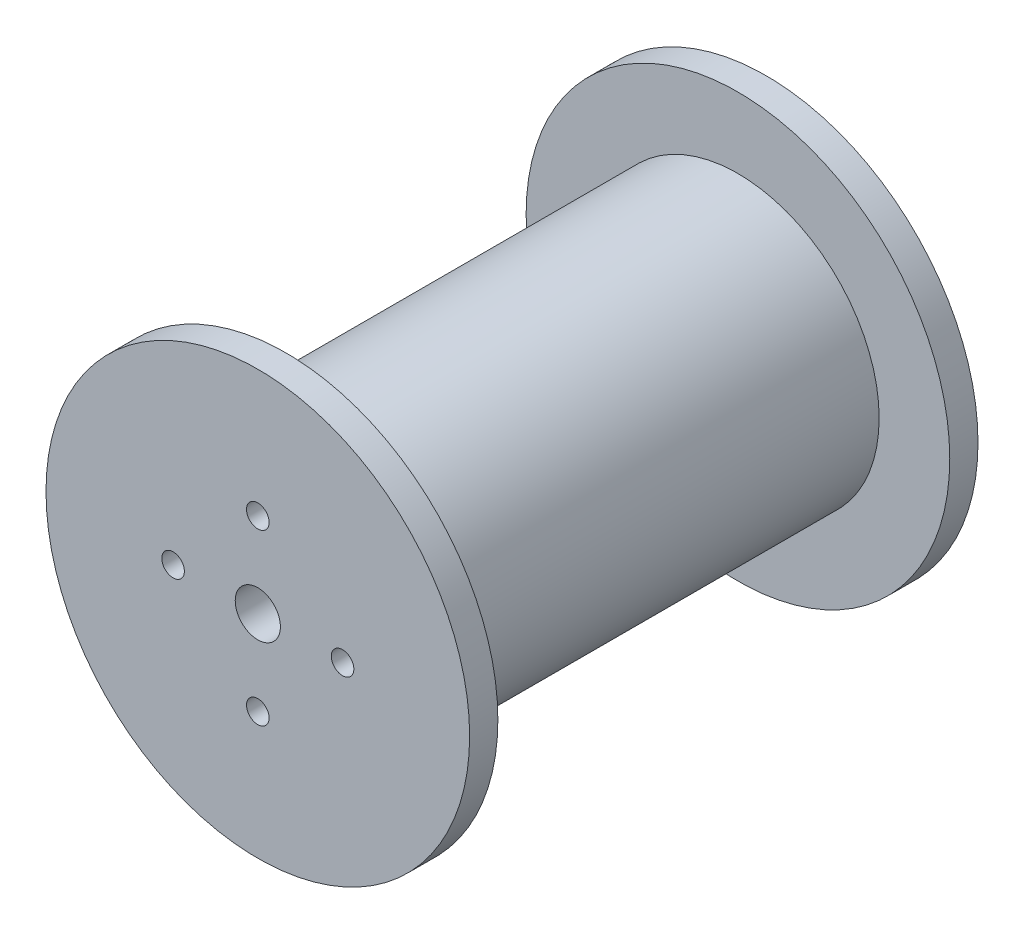
ISO-10303-21;
HEADER;
FILE_DESCRIPTION(('STEP AP214'),'2;1');
FILE_NAME('part.step','',(''),(''),'','','');
FILE_SCHEMA(('AUTOMOTIVE_DESIGN { 1 0 10303 214 1 1 1 1 }'));
ENDSEC;
DATA;
#1=APPLICATION_CONTEXT('core data for automotive mechanical design processes');
#2=APPLICATION_PROTOCOL_DEFINITION('international standard','automotive_design',2000,#1);
#3=PRODUCT_CONTEXT('',#1,'mechanical');
#4=PRODUCT('Part','Part','',(#3));
#5=PRODUCT_RELATED_PRODUCT_CATEGORY('part','',(#4));
#6=PRODUCT_DEFINITION_FORMATION('','',#4);
#7=PRODUCT_DEFINITION_CONTEXT('part definition',#1,'design');
#8=PRODUCT_DEFINITION('design','',#6,#7);
#9=PRODUCT_DEFINITION_SHAPE('','',#8);
#10=(LENGTH_UNIT() NAMED_UNIT(*) SI_UNIT(.MILLI.,.METRE.));
#11=(NAMED_UNIT(*) PLANE_ANGLE_UNIT() SI_UNIT($,.RADIAN.));
#12=(NAMED_UNIT(*) SI_UNIT($,.STERADIAN.) SOLID_ANGLE_UNIT());
#13=UNCERTAINTY_MEASURE_WITH_UNIT(LENGTH_MEASURE(1.E-05),#10,'distance_accuracy_value','');
#14=(GEOMETRIC_REPRESENTATION_CONTEXT(3) GLOBAL_UNCERTAINTY_ASSIGNED_CONTEXT((#13)) GLOBAL_UNIT_ASSIGNED_CONTEXT((#10,
#11,#12)) REPRESENTATION_CONTEXT('',''));
#15=CARTESIAN_POINT('',(0.,0.,0.));
#16=DIRECTION('',(0.,0.,1.));
#17=DIRECTION('',(1.,0.,0.));
#18=AXIS2_PLACEMENT_3D('',#15,#16,#17);
#19=CARTESIAN_POINT('',(0.,0.,80.));
#20=DIRECTION('',(0.,0.,-1.));
#21=DIRECTION('',(-1.,0.,0.));
#22=AXIS2_PLACEMENT_3D('',#19,#20,#21);
#23=CYLINDRICAL_SURFACE('',#22,25.);
#24=CARTESIAN_POINT('',(0.,0.,80.));
#25=DIRECTION('',(0.,0.,1.));
#26=DIRECTION('',(1.,0.,0.));
#27=AXIS2_PLACEMENT_3D('',#24,#25,#26);
#28=CIRCLE('',#27,25.);
#29=CARTESIAN_POINT('',(25.,0.,80.));
#30=VERTEX_POINT('',#29);
#31=EDGE_CURVE('E10',#30,#30,#28,.T.);
#32=ORIENTED_EDGE('',*,*,#31,.F.);
#33=EDGE_LOOP('',(#32));
#34=FACE_BOUND('',#33,.T.);
#35=CARTESIAN_POINT('',(0.,0.,0.));
#36=DIRECTION('',(0.,0.,1.));
#37=DIRECTION('',(1.,0.,0.));
#38=AXIS2_PLACEMENT_3D('',#35,#36,#37);
#39=CIRCLE('',#38,25.);
#40=CARTESIAN_POINT('',(25.,0.,0.));
#41=VERTEX_POINT('',#40);
#42=EDGE_CURVE('E44',#41,#41,#39,.T.);
#43=ORIENTED_EDGE('',*,*,#42,.T.);
#44=EDGE_LOOP('',(#43));
#45=FACE_BOUND('',#44,.T.);
#46=ADVANCED_FACE('F41',(#34,#45),#23,.T.);
#47=CARTESIAN_POINT('',(0.,0.,85.));
#48=DIRECTION('',(0.,0.,-1.));
#49=DIRECTION('',(-1.,0.,0.));
#50=AXIS2_PLACEMENT_3D('',#47,#48,#49);
#51=CYLINDRICAL_SURFACE('',#50,37.5);
#52=CARTESIAN_POINT('',(0.,0.,85.));
#53=DIRECTION('',(0.,0.,1.));
#54=DIRECTION('',(1.,0.,0.));
#55=AXIS2_PLACEMENT_3D('',#52,#53,#54);
#56=CIRCLE('',#55,37.5);
#57=CARTESIAN_POINT('',(37.5,0.,85.));
#58=VERTEX_POINT('',#57);
#59=EDGE_CURVE('E49',#58,#58,#56,.T.);
#60=ORIENTED_EDGE('',*,*,#59,.F.);
#61=EDGE_LOOP('',(#60));
#62=FACE_BOUND('',#61,.T.);
#63=CARTESIAN_POINT('',(0.,0.,80.));
#64=DIRECTION('',(0.,0.,1.));
#65=DIRECTION('',(1.,0.,0.));
#66=AXIS2_PLACEMENT_3D('',#63,#64,#65);
#67=CIRCLE('',#66,37.5);
#68=CARTESIAN_POINT('',(37.5,0.,80.));
#69=VERTEX_POINT('',#68);
#70=EDGE_CURVE('E54',#69,#69,#67,.T.);
#71=ORIENTED_EDGE('',*,*,#70,.T.);
#72=EDGE_LOOP('',(#71));
#73=FACE_BOUND('',#72,.T.);
#74=ADVANCED_FACE('F150',(#62,#73),#51,.T.);
#75=CARTESIAN_POINT('',(0.,0.,85.));
#76=DIRECTION('',(0.,0.,1.));
#77=DIRECTION('',(1.,0.,0.));
#78=AXIS2_PLACEMENT_3D('',#75,#76,#77);
#79=PLANE('',#78);
#80=CARTESIAN_POINT('',(0.,15.,85.));
#81=DIRECTION('',(0.,0.,-1.));
#82=DIRECTION('',(-1.,0.,0.));
#83=AXIS2_PLACEMENT_3D('',#80,#81,#82);
#84=CIRCLE('',#83,2.);
#85=CARTESIAN_POINT('',(-2.,15.,85.));
#86=VERTEX_POINT('',#85);
#87=EDGE_CURVE('E73',#86,#86,#84,.T.);
#88=ORIENTED_EDGE('',*,*,#87,.T.);
#89=EDGE_LOOP('',(#88));
#90=FACE_BOUND('',#89,.T.);
#91=CARTESIAN_POINT('',(-15.0000000000004,4.23570186157979E-13,85.));
#92=DIRECTION('',(0.,0.,-1.));
#93=DIRECTION('',(-1.,0.,0.));
#94=AXIS2_PLACEMENT_3D('',#91,#92,#93);
#95=CIRCLE('',#94,2.00000000000033);
#96=CARTESIAN_POINT('',(-17.0000000000008,4.23570186157979E-13,85.));
#97=VERTEX_POINT('',#96);
#98=EDGE_CURVE('E81',#97,#97,#95,.T.);
#99=ORIENTED_EDGE('',*,*,#98,.T.);
#100=EDGE_LOOP('',(#99));
#101=FACE_BOUND('',#100,.T.);
#102=CARTESIAN_POINT('',(-8.47140372315957E-13,-15.,85.));
#103=DIRECTION('',(0.,0.,-1.));
#104=DIRECTION('',(-1.,0.,0.));
#105=AXIS2_PLACEMENT_3D('',#102,#103,#104);
#106=CIRCLE('',#105,2.00000000000091);
#107=CARTESIAN_POINT('',(-2.00000000000176,-15.,85.));
#108=VERTEX_POINT('',#107);
#109=EDGE_CURVE('E82',#108,#108,#106,.T.);
#110=ORIENTED_EDGE('',*,*,#109,.T.);
#111=EDGE_LOOP('',(#110));
#112=FACE_BOUND('',#111,.T.);
#113=CARTESIAN_POINT('',(14.9999999999996,-4.254071563567E-13,85.));
#114=DIRECTION('',(0.,0.,-1.));
#115=DIRECTION('',(-1.,0.,0.));
#116=AXIS2_PLACEMENT_3D('',#113,#114,#115);
#117=CIRCLE('',#116,2.00000000000068);
#118=CARTESIAN_POINT('',(12.9999999999989,-4.254071563567E-13,85.));
#119=VERTEX_POINT('',#118);
#120=EDGE_CURVE('E97',#119,#119,#117,.T.);
#121=ORIENTED_EDGE('',*,*,#120,.T.);
#122=EDGE_LOOP('',(#121));
#123=FACE_BOUND('',#122,.T.);
#124=CARTESIAN_POINT('',(0.,0.,85.));
#125=DIRECTION('',(0.,0.,-1.));
#126=DIRECTION('',(-1.,0.,0.));
#127=AXIS2_PLACEMENT_3D('',#124,#125,#126);
#128=CIRCLE('',#127,4.);
#129=CARTESIAN_POINT('',(-4.,0.,85.));
#130=VERTEX_POINT('',#129);
#131=EDGE_CURVE('E65',#130,#130,#128,.T.);
#132=ORIENTED_EDGE('',*,*,#131,.T.);
#133=EDGE_LOOP('',(#132));
#134=FACE_BOUND('',#133,.T.);
#135=ORIENTED_EDGE('',*,*,#59,.T.);
#136=EDGE_LOOP('',(#135));
#137=FACE_BOUND('',#136,.T.);
#138=ADVANCED_FACE('F109',(#90,#101,#112,#123,#134,#137),#79,.T.);
#139=CARTESIAN_POINT('',(0.,0.,80.));
#140=DIRECTION('',(0.,0.,1.));
#141=DIRECTION('',(1.,0.,0.));
#142=AXIS2_PLACEMENT_3D('',#139,#140,#141);
#143=PLANE('',#142);
#144=ORIENTED_EDGE('',*,*,#31,.T.);
#145=EDGE_LOOP('',(#144));
#146=FACE_BOUND('',#145,.T.);
#147=ORIENTED_EDGE('',*,*,#70,.F.);
#148=EDGE_LOOP('',(#147));
#149=FACE_BOUND('',#148,.T.);
#150=ADVANCED_FACE('F135',(#146,#149),#143,.F.);
#151=CARTESIAN_POINT('',(0.,0.,-5.));
#152=DIRECTION('',(0.,0.,1.));
#153=DIRECTION('',(1.,0.,0.));
#154=AXIS2_PLACEMENT_3D('',#151,#152,#153);
#155=CYLINDRICAL_SURFACE('',#154,37.5);
#156=CARTESIAN_POINT('',(0.,0.,-5.));
#157=DIRECTION('',(0.,0.,-1.));
#158=DIRECTION('',(-1.,0.,0.));
#159=AXIS2_PLACEMENT_3D('',#156,#157,#158);
#160=CIRCLE('',#159,37.5);
#161=CARTESIAN_POINT('',(-37.5,0.,-5.));
#162=VERTEX_POINT('',#161);
#163=EDGE_CURVE('E64',#162,#162,#160,.T.);
#164=ORIENTED_EDGE('',*,*,#163,.F.);
#165=EDGE_LOOP('',(#164));
#166=FACE_BOUND('',#165,.T.);
#167=CARTESIAN_POINT('',(0.,0.,0.));
#168=DIRECTION('',(0.,0.,-1.));
#169=DIRECTION('',(-1.,0.,0.));
#170=AXIS2_PLACEMENT_3D('',#167,#168,#169);
#171=CIRCLE('',#170,37.5);
#172=CARTESIAN_POINT('',(-37.5,0.,0.));
#173=VERTEX_POINT('',#172);
#174=EDGE_CURVE('E60',#173,#173,#171,.T.);
#175=ORIENTED_EDGE('',*,*,#174,.T.);
#176=EDGE_LOOP('',(#175));
#177=FACE_BOUND('',#176,.T.);
#178=ADVANCED_FACE('F124',(#166,#177),#155,.T.);
#179=CARTESIAN_POINT('',(0.,0.,-5.));
#180=DIRECTION('',(0.,0.,-1.));
#181=DIRECTION('',(-1.,0.,0.));
#182=AXIS2_PLACEMENT_3D('',#179,#180,#181);
#183=PLANE('',#182);
#184=CARTESIAN_POINT('',(0.,15.,-5.));
#185=DIRECTION('',(0.,0.,-1.));
#186=DIRECTION('',(-1.,0.,0.));
#187=AXIS2_PLACEMENT_3D('',#184,#185,#186);
#188=CIRCLE('',#187,2.);
#189=CARTESIAN_POINT('',(-2.,15.,-5.));
#190=VERTEX_POINT('',#189);
#191=EDGE_CURVE('E86',#190,#190,#188,.T.);
#192=ORIENTED_EDGE('',*,*,#191,.F.);
#193=EDGE_LOOP('',(#192));
#194=FACE_BOUND('',#193,.T.);
#195=CARTESIAN_POINT('',(-15.0000000000004,4.23570186157979E-13,-5.));
#196=DIRECTION('',(0.,0.,-1.));
#197=DIRECTION('',(-1.,0.,0.));
#198=AXIS2_PLACEMENT_3D('',#195,#196,#197);
#199=CIRCLE('',#198,2.00000000000033);
#200=CARTESIAN_POINT('',(-17.0000000000008,4.23570186157979E-13,-5.));
#201=VERTEX_POINT('',#200);
#202=EDGE_CURVE('E77',#201,#201,#199,.T.);
#203=ORIENTED_EDGE('',*,*,#202,.F.);
#204=EDGE_LOOP('',(#203));
#205=FACE_BOUND('',#204,.T.);
#206=CARTESIAN_POINT('',(-8.47140372315957E-13,-15.,-5.));
#207=DIRECTION('',(0.,0.,-1.));
#208=DIRECTION('',(-1.,0.,0.));
#209=AXIS2_PLACEMENT_3D('',#206,#207,#208);
#210=CIRCLE('',#209,2.00000000000091);
#211=CARTESIAN_POINT('',(-2.00000000000176,-15.,-5.));
#212=VERTEX_POINT('',#211);
#213=EDGE_CURVE('E101',#212,#212,#210,.T.);
#214=ORIENTED_EDGE('',*,*,#213,.F.);
#215=EDGE_LOOP('',(#214));
#216=FACE_BOUND('',#215,.T.);
#217=CARTESIAN_POINT('',(14.9999999999996,-4.254071563567E-13,-5.));
#218=DIRECTION('',(0.,0.,-1.));
#219=DIRECTION('',(-1.,0.,0.));
#220=AXIS2_PLACEMENT_3D('',#217,#218,#219);
#221=CIRCLE('',#220,2.00000000000068);
#222=CARTESIAN_POINT('',(12.9999999999989,-4.254071563567E-13,-5.));
#223=VERTEX_POINT('',#222);
#224=EDGE_CURVE('E93',#223,#223,#221,.T.);
#225=ORIENTED_EDGE('',*,*,#224,.F.);
#226=EDGE_LOOP('',(#225));
#227=FACE_BOUND('',#226,.T.);
#228=CARTESIAN_POINT('',(0.,0.,-5.));
#229=DIRECTION('',(0.,0.,-1.));
#230=DIRECTION('',(-1.,0.,0.));
#231=AXIS2_PLACEMENT_3D('',#228,#229,#230);
#232=CIRCLE('',#231,4.);
#233=CARTESIAN_POINT('',(-4.,0.,-5.));
#234=VERTEX_POINT('',#233);
#235=EDGE_CURVE('E69',#234,#234,#232,.T.);
#236=ORIENTED_EDGE('',*,*,#235,.F.);
#237=EDGE_LOOP('',(#236));
#238=FACE_BOUND('',#237,.T.);
#239=ORIENTED_EDGE('',*,*,#163,.T.);
#240=EDGE_LOOP('',(#239));
#241=FACE_BOUND('',#240,.T.);
#242=ADVANCED_FACE('F120',(#194,#205,#216,#227,#238,#241),#183,.T.);
#243=CARTESIAN_POINT('',(0.,0.,0.));
#244=DIRECTION('',(0.,0.,-1.));
#245=DIRECTION('',(-1.,0.,0.));
#246=AXIS2_PLACEMENT_3D('',#243,#244,#245);
#247=PLANE('',#246);
#248=ORIENTED_EDGE('',*,*,#42,.F.);
#249=EDGE_LOOP('',(#248));
#250=FACE_BOUND('',#249,.T.);
#251=ORIENTED_EDGE('',*,*,#174,.F.);
#252=EDGE_LOOP('',(#251));
#253=FACE_BOUND('',#252,.T.);
#254=ADVANCED_FACE('F123',(#250,#253),#247,.F.);
#255=CARTESIAN_POINT('',(0.,0.,85.));
#256=DIRECTION('',(0.,0.,-1.));
#257=DIRECTION('',(-1.,0.,0.));
#258=AXIS2_PLACEMENT_3D('',#255,#256,#257);
#259=CYLINDRICAL_SURFACE('',#258,4.);
#260=CARTESIAN_POINT('',(-4.,0.,85.));
#261=CARTESIAN_POINT('',(-4.,0.,84.0625));
#262=CARTESIAN_POINT('',(-4.,0.,83.125));
#263=CARTESIAN_POINT('',(-4.,0.,81.25));
#264=CARTESIAN_POINT('',(-4.,0.,80.3125));
#265=CARTESIAN_POINT('',(-4.,0.,78.4375));
#266=CARTESIAN_POINT('',(-4.,0.,77.5));
#267=CARTESIAN_POINT('',(-4.,0.,75.625));
#268=CARTESIAN_POINT('',(-4.,0.,74.6875));
#269=CARTESIAN_POINT('',(-4.,0.,72.8125));
#270=CARTESIAN_POINT('',(-4.,0.,71.875));
#271=CARTESIAN_POINT('',(-4.,0.,70.));
#272=CARTESIAN_POINT('',(-4.,0.,69.0625));
#273=CARTESIAN_POINT('',(-4.,0.,67.1875));
#274=CARTESIAN_POINT('',(-4.,0.,66.25));
#275=CARTESIAN_POINT('',(-4.,0.,64.375));
#276=CARTESIAN_POINT('',(-4.,0.,63.4375));
#277=CARTESIAN_POINT('',(-4.,0.,61.5625));
#278=CARTESIAN_POINT('',(-4.,0.,60.625));
#279=CARTESIAN_POINT('',(-4.,0.,58.75));
#280=CARTESIAN_POINT('',(-4.,0.,57.8125));
#281=CARTESIAN_POINT('',(-4.,0.,55.9375));
#282=CARTESIAN_POINT('',(-4.,0.,55.));
#283=CARTESIAN_POINT('',(-4.,0.,53.125));
#284=CARTESIAN_POINT('',(-4.,0.,52.1875));
#285=CARTESIAN_POINT('',(-4.,0.,50.3125));
#286=CARTESIAN_POINT('',(-4.,0.,49.375));
#287=CARTESIAN_POINT('',(-4.,0.,47.5));
#288=CARTESIAN_POINT('',(-4.,0.,46.5625));
#289=CARTESIAN_POINT('',(-4.,0.,44.6875));
#290=CARTESIAN_POINT('',(-4.,0.,43.75));
#291=CARTESIAN_POINT('',(-4.,0.,41.875));
#292=CARTESIAN_POINT('',(-4.,0.,40.9375));
#293=CARTESIAN_POINT('',(-4.,0.,39.0625));
#294=CARTESIAN_POINT('',(-4.,0.,38.125));
#295=CARTESIAN_POINT('',(-4.,0.,36.25));
#296=CARTESIAN_POINT('',(-4.,0.,35.3125));
#297=CARTESIAN_POINT('',(-4.,0.,33.4375));
#298=CARTESIAN_POINT('',(-4.,0.,32.5));
#299=CARTESIAN_POINT('',(-4.,0.,30.625));
#300=CARTESIAN_POINT('',(-4.,0.,29.6875));
#301=CARTESIAN_POINT('',(-4.,0.,27.8125));
#302=CARTESIAN_POINT('',(-4.,0.,26.875));
#303=CARTESIAN_POINT('',(-4.,0.,25.));
#304=CARTESIAN_POINT('',(-4.,0.,24.0625));
#305=CARTESIAN_POINT('',(-4.,0.,22.1875));
#306=CARTESIAN_POINT('',(-4.,0.,21.25));
#307=CARTESIAN_POINT('',(-4.,0.,19.375));
#308=CARTESIAN_POINT('',(-4.,0.,18.4375));
#309=CARTESIAN_POINT('',(-4.,0.,16.5625));
#310=CARTESIAN_POINT('',(-4.,0.,15.625));
#311=CARTESIAN_POINT('',(-4.,0.,13.75));
#312=CARTESIAN_POINT('',(-4.,0.,12.8125));
#313=CARTESIAN_POINT('',(-4.,0.,10.9375));
#314=CARTESIAN_POINT('',(-4.,0.,10.));
#315=CARTESIAN_POINT('',(-4.,0.,8.125));
#316=CARTESIAN_POINT('',(-4.,0.,7.1875));
#317=CARTESIAN_POINT('',(-4.,0.,5.3125));
#318=CARTESIAN_POINT('',(-4.,0.,4.375));
#319=CARTESIAN_POINT('',(-4.,0.,2.5));
#320=CARTESIAN_POINT('',(-4.,0.,1.5625));
#321=CARTESIAN_POINT('',(-4.,0.,-0.312500000000003));
#322=CARTESIAN_POINT('',(-4.,0.,-1.25000000000001));
#323=CARTESIAN_POINT('',(-4.,0.,-3.12500000000001));
#324=CARTESIAN_POINT('',(-4.,0.,-4.0625));
#325=CARTESIAN_POINT('',(-4.,0.,-5.));
#326=B_SPLINE_CURVE_WITH_KNOTS('',3,(#260,#261,#262,#263,#264,#265,#266,#267,#268,#269,#270,
#271,#272,#273,#274,#275,#276,#277,#278,#279,#280,#281,#282,#283,#284,#285,#286,#287,#288,#289,
#290,#291,#292,#293,#294,#295,#296,#297,#298,#299,#300,#301,#302,#303,#304,#305,#306,#307,#308,
#309,#310,#311,#312,#313,#314,#315,#316,#317,#318,#319,#320,#321,#322,#323,#324,#325),
.UNSPECIFIED.,.F.,.F.,(4,2,2,2,2,2,2,2,2,2,2,2,2,2,2,2,2,2,2,2,2,2,2,2,2,2,2,2,2,2,2,2,4),(0.,
2.81250000000001,5.62500000000001,8.43750000000001,11.25,14.0625,16.875,19.6875,22.5,25.3125,
28.125,30.9375,33.75,36.5625,39.375,42.1875,45.,47.8125,50.625,53.4375,56.25,59.0625,61.875,
64.6875,67.5,70.3125,73.125,75.9375,78.75,81.5625,84.375,87.1875,90.),.UNSPECIFIED.);
#327=EDGE_CURVE('BSEAM140',#130,#234,#326,.T.);
#328=ORIENTED_EDGE('',*,*,#131,.F.);
#329=ORIENTED_EDGE('',*,*,#235,.T.);
#330=ORIENTED_EDGE('',*,*,#327,.T.);
#331=ORIENTED_EDGE('',*,*,#327,.F.);
#332=EDGE_LOOP('',(#328,#330,#329,#331));
#333=FACE_BOUND('',#332,.T.);
#334=ADVANCED_FACE('F140',(#333),#259,.F.);
#335=CARTESIAN_POINT('',(14.9999999999996,-4.254071563567E-13,85.));
#336=DIRECTION('',(0.,0.,-1.));
#337=DIRECTION('',(-1.,0.,0.));
#338=AXIS2_PLACEMENT_3D('',#335,#336,#337);
#339=CYLINDRICAL_SURFACE('',#338,2.00000000000068);
#340=CARTESIAN_POINT('',(12.9999999999989,-4.254071563567E-13,85.));
#341=CARTESIAN_POINT('',(12.9999999999989,-4.254071563567E-13,84.0625));
#342=CARTESIAN_POINT('',(12.9999999999989,-4.254071563567E-13,83.125));
#343=CARTESIAN_POINT('',(12.9999999999989,-4.254071563567E-13,81.25));
#344=CARTESIAN_POINT('',(12.9999999999989,-4.254071563567E-13,80.3125));
#345=CARTESIAN_POINT('',(12.9999999999989,-4.254071563567E-13,78.4375));
#346=CARTESIAN_POINT('',(12.9999999999989,-4.254071563567E-13,77.5));
#347=CARTESIAN_POINT('',(12.9999999999989,-4.254071563567E-13,75.625));
#348=CARTESIAN_POINT('',(12.9999999999989,-4.254071563567E-13,74.6875));
#349=CARTESIAN_POINT('',(12.9999999999989,-4.254071563567E-13,72.8125));
#350=CARTESIAN_POINT('',(12.9999999999989,-4.254071563567E-13,71.875));
#351=CARTESIAN_POINT('',(12.9999999999989,-4.254071563567E-13,70.));
#352=CARTESIAN_POINT('',(12.9999999999989,-4.254071563567E-13,69.0625));
#353=CARTESIAN_POINT('',(12.9999999999989,-4.254071563567E-13,67.1875));
#354=CARTESIAN_POINT('',(12.9999999999989,-4.254071563567E-13,66.25));
#355=CARTESIAN_POINT('',(12.9999999999989,-4.254071563567E-13,64.375));
#356=CARTESIAN_POINT('',(12.9999999999989,-4.254071563567E-13,63.4375));
#357=CARTESIAN_POINT('',(12.9999999999989,-4.254071563567E-13,61.5625));
#358=CARTESIAN_POINT('',(12.9999999999989,-4.254071563567E-13,60.625));
#359=CARTESIAN_POINT('',(12.9999999999989,-4.254071563567E-13,58.75));
#360=CARTESIAN_POINT('',(12.9999999999989,-4.254071563567E-13,57.8125));
#361=CARTESIAN_POINT('',(12.9999999999989,-4.254071563567E-13,55.9375));
#362=CARTESIAN_POINT('',(12.9999999999989,-4.254071563567E-13,55.));
#363=CARTESIAN_POINT('',(12.9999999999989,-4.254071563567E-13,53.125));
#364=CARTESIAN_POINT('',(12.9999999999989,-4.254071563567E-13,52.1875));
#365=CARTESIAN_POINT('',(12.9999999999989,-4.254071563567E-13,50.3125));
#366=CARTESIAN_POINT('',(12.9999999999989,-4.254071563567E-13,49.375));
#367=CARTESIAN_POINT('',(12.9999999999989,-4.254071563567E-13,47.5));
#368=CARTESIAN_POINT('',(12.9999999999989,-4.254071563567E-13,46.5625));
#369=CARTESIAN_POINT('',(12.9999999999989,-4.254071563567E-13,44.6875));
#370=CARTESIAN_POINT('',(12.9999999999989,-4.254071563567E-13,43.75));
#371=CARTESIAN_POINT('',(12.9999999999989,-4.254071563567E-13,41.875));
#372=CARTESIAN_POINT('',(12.9999999999989,-4.254071563567E-13,40.9375));
#373=CARTESIAN_POINT('',(12.9999999999989,-4.254071563567E-13,39.0625));
#374=CARTESIAN_POINT('',(12.9999999999989,-4.254071563567E-13,38.125));
#375=CARTESIAN_POINT('',(12.9999999999989,-4.254071563567E-13,36.25));
#376=CARTESIAN_POINT('',(12.9999999999989,-4.254071563567E-13,35.3125));
#377=CARTESIAN_POINT('',(12.9999999999989,-4.254071563567E-13,33.4375));
#378=CARTESIAN_POINT('',(12.9999999999989,-4.254071563567E-13,32.5));
#379=CARTESIAN_POINT('',(12.9999999999989,-4.254071563567E-13,30.625));
#380=CARTESIAN_POINT('',(12.9999999999989,-4.254071563567E-13,29.6875));
#381=CARTESIAN_POINT('',(12.9999999999989,-4.254071563567E-13,27.8125));
#382=CARTESIAN_POINT('',(12.9999999999989,-4.254071563567E-13,26.875));
#383=CARTESIAN_POINT('',(12.9999999999989,-4.254071563567E-13,25.));
#384=CARTESIAN_POINT('',(12.9999999999989,-4.254071563567E-13,24.0625));
#385=CARTESIAN_POINT('',(12.9999999999989,-4.254071563567E-13,22.1875));
#386=CARTESIAN_POINT('',(12.9999999999989,-4.254071563567E-13,21.25));
#387=CARTESIAN_POINT('',(12.9999999999989,-4.254071563567E-13,19.375));
#388=CARTESIAN_POINT('',(12.9999999999989,-4.254071563567E-13,18.4375));
#389=CARTESIAN_POINT('',(12.9999999999989,-4.254071563567E-13,16.5625));
#390=CARTESIAN_POINT('',(12.9999999999989,-4.254071563567E-13,15.625));
#391=CARTESIAN_POINT('',(12.9999999999989,-4.254071563567E-13,13.75));
#392=CARTESIAN_POINT('',(12.9999999999989,-4.254071563567E-13,12.8125));
#393=CARTESIAN_POINT('',(12.9999999999989,-4.254071563567E-13,10.9375));
#394=CARTESIAN_POINT('',(12.9999999999989,-4.254071563567E-13,10.));
#395=CARTESIAN_POINT('',(12.9999999999989,-4.254071563567E-13,8.125));
#396=CARTESIAN_POINT('',(12.9999999999989,-4.254071563567E-13,7.1875));
#397=CARTESIAN_POINT('',(12.9999999999989,-4.254071563567E-13,5.3125));
#398=CARTESIAN_POINT('',(12.9999999999989,-4.254071563567E-13,4.375));
#399=CARTESIAN_POINT('',(12.9999999999989,-4.254071563567E-13,2.5));
#400=CARTESIAN_POINT('',(12.9999999999989,-4.254071563567E-13,1.5625));
#401=CARTESIAN_POINT('',(12.9999999999989,-4.254071563567E-13,-0.312500000000003));
#402=CARTESIAN_POINT('',(12.9999999999989,-4.254071563567E-13,-1.25000000000001));
#403=CARTESIAN_POINT('',(12.9999999999989,-4.254071563567E-13,-3.12500000000001));
#404=CARTESIAN_POINT('',(12.9999999999989,-4.254071563567E-13,-4.0625));
#405=CARTESIAN_POINT('',(12.9999999999989,-4.254071563567E-13,-5.));
#406=B_SPLINE_CURVE_WITH_KNOTS('',3,(#340,#341,#342,#343,#344,#345,#346,#347,#348,#349,#350,
#351,#352,#353,#354,#355,#356,#357,#358,#359,#360,#361,#362,#363,#364,#365,#366,#367,#368,#369,
#370,#371,#372,#373,#374,#375,#376,#377,#378,#379,#380,#381,#382,#383,#384,#385,#386,#387,#388,
#389,#390,#391,#392,#393,#394,#395,#396,#397,#398,#399,#400,#401,#402,#403,#404,#405),
.UNSPECIFIED.,.F.,.F.,(4,2,2,2,2,2,2,2,2,2,2,2,2,2,2,2,2,2,2,2,2,2,2,2,2,2,2,2,2,2,2,2,4),(0.,
2.81250000000001,5.62500000000001,8.43750000000001,11.25,14.0625,16.875,19.6875,22.5,25.3125,
28.125,30.9375,33.75,36.5625,39.375,42.1875,45.,47.8125,50.625,53.4375,56.25,59.0625,61.875,
64.6875,67.5,70.3125,73.125,75.9375,78.75,81.5625,84.375,87.1875,90.),.UNSPECIFIED.);
#407=EDGE_CURVE('BSEAM116',#119,#223,#406,.T.);
#408=ORIENTED_EDGE('',*,*,#120,.F.);
#409=ORIENTED_EDGE('',*,*,#224,.T.);
#410=ORIENTED_EDGE('',*,*,#407,.T.);
#411=ORIENTED_EDGE('',*,*,#407,.F.);
#412=EDGE_LOOP('',(#408,#410,#409,#411));
#413=FACE_BOUND('',#412,.T.);
#414=ADVANCED_FACE('F116',(#413),#339,.F.);
#415=CARTESIAN_POINT('',(-8.47140372315957E-13,-15.,85.));
#416=DIRECTION('',(0.,0.,-1.));
#417=DIRECTION('',(-1.,0.,0.));
#418=AXIS2_PLACEMENT_3D('',#415,#416,#417);
#419=CYLINDRICAL_SURFACE('',#418,2.00000000000091);
#420=CARTESIAN_POINT('',(-2.00000000000176,-15.,85.));
#421=CARTESIAN_POINT('',(-2.00000000000176,-15.,84.0625));
#422=CARTESIAN_POINT('',(-2.00000000000176,-15.,83.125));
#423=CARTESIAN_POINT('',(-2.00000000000176,-15.,81.25));
#424=CARTESIAN_POINT('',(-2.00000000000176,-15.,80.3125));
#425=CARTESIAN_POINT('',(-2.00000000000176,-15.,78.4375));
#426=CARTESIAN_POINT('',(-2.00000000000176,-15.,77.5));
#427=CARTESIAN_POINT('',(-2.00000000000176,-15.,75.625));
#428=CARTESIAN_POINT('',(-2.00000000000176,-15.,74.6875));
#429=CARTESIAN_POINT('',(-2.00000000000176,-15.,72.8125));
#430=CARTESIAN_POINT('',(-2.00000000000176,-15.,71.875));
#431=CARTESIAN_POINT('',(-2.00000000000176,-15.,70.));
#432=CARTESIAN_POINT('',(-2.00000000000176,-15.,69.0625));
#433=CARTESIAN_POINT('',(-2.00000000000176,-15.,67.1875));
#434=CARTESIAN_POINT('',(-2.00000000000176,-15.,66.25));
#435=CARTESIAN_POINT('',(-2.00000000000176,-15.,64.375));
#436=CARTESIAN_POINT('',(-2.00000000000176,-15.,63.4375));
#437=CARTESIAN_POINT('',(-2.00000000000176,-15.,61.5625));
#438=CARTESIAN_POINT('',(-2.00000000000176,-15.,60.625));
#439=CARTESIAN_POINT('',(-2.00000000000176,-15.,58.75));
#440=CARTESIAN_POINT('',(-2.00000000000176,-15.,57.8125));
#441=CARTESIAN_POINT('',(-2.00000000000176,-15.,55.9375));
#442=CARTESIAN_POINT('',(-2.00000000000176,-15.,55.));
#443=CARTESIAN_POINT('',(-2.00000000000176,-15.,53.125));
#444=CARTESIAN_POINT('',(-2.00000000000176,-15.,52.1875));
#445=CARTESIAN_POINT('',(-2.00000000000176,-15.,50.3125));
#446=CARTESIAN_POINT('',(-2.00000000000176,-15.,49.375));
#447=CARTESIAN_POINT('',(-2.00000000000176,-15.,47.5));
#448=CARTESIAN_POINT('',(-2.00000000000176,-15.,46.5625));
#449=CARTESIAN_POINT('',(-2.00000000000176,-15.,44.6875));
#450=CARTESIAN_POINT('',(-2.00000000000176,-15.,43.75));
#451=CARTESIAN_POINT('',(-2.00000000000176,-15.,41.875));
#452=CARTESIAN_POINT('',(-2.00000000000176,-15.,40.9375));
#453=CARTESIAN_POINT('',(-2.00000000000176,-15.,39.0625));
#454=CARTESIAN_POINT('',(-2.00000000000176,-15.,38.125));
#455=CARTESIAN_POINT('',(-2.00000000000176,-15.,36.25));
#456=CARTESIAN_POINT('',(-2.00000000000176,-15.,35.3125));
#457=CARTESIAN_POINT('',(-2.00000000000176,-15.,33.4375));
#458=CARTESIAN_POINT('',(-2.00000000000176,-15.,32.5));
#459=CARTESIAN_POINT('',(-2.00000000000176,-15.,30.625));
#460=CARTESIAN_POINT('',(-2.00000000000176,-15.,29.6875));
#461=CARTESIAN_POINT('',(-2.00000000000176,-15.,27.8125));
#462=CARTESIAN_POINT('',(-2.00000000000176,-15.,26.875));
#463=CARTESIAN_POINT('',(-2.00000000000176,-15.,25.));
#464=CARTESIAN_POINT('',(-2.00000000000176,-15.,24.0625));
#465=CARTESIAN_POINT('',(-2.00000000000176,-15.,22.1875));
#466=CARTESIAN_POINT('',(-2.00000000000176,-15.,21.25));
#467=CARTESIAN_POINT('',(-2.00000000000176,-15.,19.375));
#468=CARTESIAN_POINT('',(-2.00000000000176,-15.,18.4375));
#469=CARTESIAN_POINT('',(-2.00000000000176,-15.,16.5625));
#470=CARTESIAN_POINT('',(-2.00000000000176,-15.,15.625));
#471=CARTESIAN_POINT('',(-2.00000000000176,-15.,13.75));
#472=CARTESIAN_POINT('',(-2.00000000000176,-15.,12.8125));
#473=CARTESIAN_POINT('',(-2.00000000000176,-15.,10.9375));
#474=CARTESIAN_POINT('',(-2.00000000000176,-15.,10.));
#475=CARTESIAN_POINT('',(-2.00000000000176,-15.,8.125));
#476=CARTESIAN_POINT('',(-2.00000000000176,-15.,7.1875));
#477=CARTESIAN_POINT('',(-2.00000000000176,-15.,5.3125));
#478=CARTESIAN_POINT('',(-2.00000000000176,-15.,4.375));
#479=CARTESIAN_POINT('',(-2.00000000000176,-15.,2.5));
#480=CARTESIAN_POINT('',(-2.00000000000176,-15.,1.5625));
#481=CARTESIAN_POINT('',(-2.00000000000176,-15.,-0.312500000000003));
#482=CARTESIAN_POINT('',(-2.00000000000176,-15.,-1.25000000000001));
#483=CARTESIAN_POINT('',(-2.00000000000176,-15.,-3.12500000000001));
#484=CARTESIAN_POINT('',(-2.00000000000176,-15.,-4.0625));
#485=CARTESIAN_POINT('',(-2.00000000000176,-15.,-5.));
#486=B_SPLINE_CURVE_WITH_KNOTS('',3,(#420,#421,#422,#423,#424,#425,#426,#427,#428,#429,#430,
#431,#432,#433,#434,#435,#436,#437,#438,#439,#440,#441,#442,#443,#444,#445,#446,#447,#448,#449,
#450,#451,#452,#453,#454,#455,#456,#457,#458,#459,#460,#461,#462,#463,#464,#465,#466,#467,#468,
#469,#470,#471,#472,#473,#474,#475,#476,#477,#478,#479,#480,#481,#482,#483,#484,#485),
.UNSPECIFIED.,.F.,.F.,(4,2,2,2,2,2,2,2,2,2,2,2,2,2,2,2,2,2,2,2,2,2,2,2,2,2,2,2,2,2,2,2,4),(0.,
2.81250000000001,5.62500000000001,8.43750000000001,11.25,14.0625,16.875,19.6875,22.5,25.3125,
28.125,30.9375,33.75,36.5625,39.375,42.1875,45.,47.8125,50.625,53.4375,56.25,59.0625,61.875,
64.6875,67.5,70.3125,73.125,75.9375,78.75,81.5625,84.375,87.1875,90.),.UNSPECIFIED.);
#487=EDGE_CURVE('BSEAM112',#108,#212,#486,.T.);
#488=ORIENTED_EDGE('',*,*,#109,.F.);
#489=ORIENTED_EDGE('',*,*,#213,.T.);
#490=ORIENTED_EDGE('',*,*,#487,.T.);
#491=ORIENTED_EDGE('',*,*,#487,.F.);
#492=EDGE_LOOP('',(#488,#490,#489,#491));
#493=FACE_BOUND('',#492,.T.);
#494=ADVANCED_FACE('F112',(#493),#419,.F.);
#495=CARTESIAN_POINT('',(-15.0000000000004,4.23570186157979E-13,85.));
#496=DIRECTION('',(0.,0.,-1.));
#497=DIRECTION('',(-1.,0.,0.));
#498=AXIS2_PLACEMENT_3D('',#495,#496,#497);
#499=CYLINDRICAL_SURFACE('',#498,2.00000000000033);
#500=CARTESIAN_POINT('',(-17.0000000000008,4.23570186157979E-13,85.));
#501=CARTESIAN_POINT('',(-17.0000000000008,4.23570186157979E-13,84.0625));
#502=CARTESIAN_POINT('',(-17.0000000000008,4.23570186157979E-13,83.125));
#503=CARTESIAN_POINT('',(-17.0000000000008,4.23570186157979E-13,81.25));
#504=CARTESIAN_POINT('',(-17.0000000000008,4.23570186157979E-13,80.3125));
#505=CARTESIAN_POINT('',(-17.0000000000008,4.23570186157979E-13,78.4375));
#506=CARTESIAN_POINT('',(-17.0000000000008,4.23570186157979E-13,77.5));
#507=CARTESIAN_POINT('',(-17.0000000000008,4.23570186157979E-13,75.625));
#508=CARTESIAN_POINT('',(-17.0000000000008,4.23570186157979E-13,74.6875));
#509=CARTESIAN_POINT('',(-17.0000000000008,4.23570186157979E-13,72.8125));
#510=CARTESIAN_POINT('',(-17.0000000000008,4.23570186157979E-13,71.875));
#511=CARTESIAN_POINT('',(-17.0000000000008,4.23570186157979E-13,70.));
#512=CARTESIAN_POINT('',(-17.0000000000008,4.23570186157979E-13,69.0625));
#513=CARTESIAN_POINT('',(-17.0000000000008,4.23570186157979E-13,67.1875));
#514=CARTESIAN_POINT('',(-17.0000000000008,4.23570186157979E-13,66.25));
#515=CARTESIAN_POINT('',(-17.0000000000008,4.23570186157979E-13,64.375));
#516=CARTESIAN_POINT('',(-17.0000000000008,4.23570186157979E-13,63.4375));
#517=CARTESIAN_POINT('',(-17.0000000000008,4.23570186157979E-13,61.5625));
#518=CARTESIAN_POINT('',(-17.0000000000008,4.23570186157979E-13,60.625));
#519=CARTESIAN_POINT('',(-17.0000000000008,4.23570186157979E-13,58.75));
#520=CARTESIAN_POINT('',(-17.0000000000008,4.23570186157979E-13,57.8125));
#521=CARTESIAN_POINT('',(-17.0000000000008,4.23570186157979E-13,55.9375));
#522=CARTESIAN_POINT('',(-17.0000000000008,4.23570186157979E-13,55.));
#523=CARTESIAN_POINT('',(-17.0000000000008,4.23570186157979E-13,53.125));
#524=CARTESIAN_POINT('',(-17.0000000000008,4.23570186157979E-13,52.1875));
#525=CARTESIAN_POINT('',(-17.0000000000008,4.23570186157979E-13,50.3125));
#526=CARTESIAN_POINT('',(-17.0000000000008,4.23570186157979E-13,49.375));
#527=CARTESIAN_POINT('',(-17.0000000000008,4.23570186157979E-13,47.5));
#528=CARTESIAN_POINT('',(-17.0000000000008,4.23570186157979E-13,46.5625));
#529=CARTESIAN_POINT('',(-17.0000000000008,4.23570186157979E-13,44.6875));
#530=CARTESIAN_POINT('',(-17.0000000000008,4.23570186157979E-13,43.75));
#531=CARTESIAN_POINT('',(-17.0000000000008,4.23570186157979E-13,41.875));
#532=CARTESIAN_POINT('',(-17.0000000000008,4.23570186157979E-13,40.9375));
#533=CARTESIAN_POINT('',(-17.0000000000008,4.23570186157979E-13,39.0625));
#534=CARTESIAN_POINT('',(-17.0000000000008,4.23570186157979E-13,38.125));
#535=CARTESIAN_POINT('',(-17.0000000000008,4.23570186157979E-13,36.25));
#536=CARTESIAN_POINT('',(-17.0000000000008,4.23570186157979E-13,35.3125));
#537=CARTESIAN_POINT('',(-17.0000000000008,4.23570186157979E-13,33.4375));
#538=CARTESIAN_POINT('',(-17.0000000000008,4.23570186157979E-13,32.5));
#539=CARTESIAN_POINT('',(-17.0000000000008,4.23570186157979E-13,30.625));
#540=CARTESIAN_POINT('',(-17.0000000000008,4.23570186157979E-13,29.6875));
#541=CARTESIAN_POINT('',(-17.0000000000008,4.23570186157979E-13,27.8125));
#542=CARTESIAN_POINT('',(-17.0000000000008,4.23570186157979E-13,26.875));
#543=CARTESIAN_POINT('',(-17.0000000000008,4.23570186157979E-13,25.));
#544=CARTESIAN_POINT('',(-17.0000000000008,4.23570186157979E-13,24.0625));
#545=CARTESIAN_POINT('',(-17.0000000000008,4.23570186157979E-13,22.1875));
#546=CARTESIAN_POINT('',(-17.0000000000008,4.23570186157979E-13,21.25));
#547=CARTESIAN_POINT('',(-17.0000000000008,4.23570186157979E-13,19.375));
#548=CARTESIAN_POINT('',(-17.0000000000008,4.23570186157979E-13,18.4375));
#549=CARTESIAN_POINT('',(-17.0000000000008,4.23570186157979E-13,16.5625));
#550=CARTESIAN_POINT('',(-17.0000000000008,4.23570186157979E-13,15.625));
#551=CARTESIAN_POINT('',(-17.0000000000008,4.23570186157979E-13,13.75));
#552=CARTESIAN_POINT('',(-17.0000000000008,4.23570186157979E-13,12.8125));
#553=CARTESIAN_POINT('',(-17.0000000000008,4.23570186157979E-13,10.9375));
#554=CARTESIAN_POINT('',(-17.0000000000008,4.23570186157979E-13,10.));
#555=CARTESIAN_POINT('',(-17.0000000000008,4.23570186157979E-13,8.125));
#556=CARTESIAN_POINT('',(-17.0000000000008,4.23570186157979E-13,7.1875));
#557=CARTESIAN_POINT('',(-17.0000000000008,4.23570186157979E-13,5.3125));
#558=CARTESIAN_POINT('',(-17.0000000000008,4.23570186157979E-13,4.375));
#559=CARTESIAN_POINT('',(-17.0000000000008,4.23570186157979E-13,2.5));
#560=CARTESIAN_POINT('',(-17.0000000000008,4.23570186157979E-13,1.5625));
#561=CARTESIAN_POINT('',(-17.0000000000008,4.23570186157979E-13,-0.312500000000003));
#562=CARTESIAN_POINT('',(-17.0000000000008,4.23570186157979E-13,-1.25000000000001));
#563=CARTESIAN_POINT('',(-17.0000000000008,4.23570186157979E-13,-3.12500000000001));
#564=CARTESIAN_POINT('',(-17.0000000000008,4.23570186157979E-13,-4.0625));
#565=CARTESIAN_POINT('',(-17.0000000000008,4.23570186157979E-13,-5.));
#566=B_SPLINE_CURVE_WITH_KNOTS('',3,(#500,#501,#502,#503,#504,#505,#506,#507,#508,#509,#510,
#511,#512,#513,#514,#515,#516,#517,#518,#519,#520,#521,#522,#523,#524,#525,#526,#527,#528,#529,
#530,#531,#532,#533,#534,#535,#536,#537,#538,#539,#540,#541,#542,#543,#544,#545,#546,#547,#548,
#549,#550,#551,#552,#553,#554,#555,#556,#557,#558,#559,#560,#561,#562,#563,#564,#565),
.UNSPECIFIED.,.F.,.F.,(4,2,2,2,2,2,2,2,2,2,2,2,2,2,2,2,2,2,2,2,2,2,2,2,2,2,2,2,2,2,2,2,4),(0.,
2.81250000000001,5.62500000000001,8.43750000000001,11.25,14.0625,16.875,19.6875,22.5,25.3125,
28.125,30.9375,33.75,36.5625,39.375,42.1875,45.,47.8125,50.625,53.4375,56.25,59.0625,61.875,
64.6875,67.5,70.3125,73.125,75.9375,78.75,81.5625,84.375,87.1875,90.),.UNSPECIFIED.);
#567=EDGE_CURVE('BSEAM115',#97,#201,#566,.T.);
#568=ORIENTED_EDGE('',*,*,#98,.F.);
#569=ORIENTED_EDGE('',*,*,#202,.T.);
#570=ORIENTED_EDGE('',*,*,#567,.T.);
#571=ORIENTED_EDGE('',*,*,#567,.F.);
#572=EDGE_LOOP('',(#568,#570,#569,#571));
#573=FACE_BOUND('',#572,.T.);
#574=ADVANCED_FACE('F115',(#573),#499,.F.);
#575=CARTESIAN_POINT('',(0.,15.,85.));
#576=DIRECTION('',(0.,0.,-1.));
#577=DIRECTION('',(-1.,0.,0.));
#578=AXIS2_PLACEMENT_3D('',#575,#576,#577);
#579=CYLINDRICAL_SURFACE('',#578,2.);
#580=CARTESIAN_POINT('',(-2.,15.,85.));
#581=CARTESIAN_POINT('',(-2.,15.,84.0625));
#582=CARTESIAN_POINT('',(-2.,15.,83.125));
#583=CARTESIAN_POINT('',(-2.,15.,81.25));
#584=CARTESIAN_POINT('',(-2.,15.,80.3125));
#585=CARTESIAN_POINT('',(-2.,15.,78.4375));
#586=CARTESIAN_POINT('',(-2.,15.,77.5));
#587=CARTESIAN_POINT('',(-2.,15.,75.625));
#588=CARTESIAN_POINT('',(-2.,15.,74.6875));
#589=CARTESIAN_POINT('',(-2.,15.,72.8125));
#590=CARTESIAN_POINT('',(-2.,15.,71.875));
#591=CARTESIAN_POINT('',(-2.,15.,70.));
#592=CARTESIAN_POINT('',(-2.,15.,69.0625));
#593=CARTESIAN_POINT('',(-2.,15.,67.1875));
#594=CARTESIAN_POINT('',(-2.,15.,66.25));
#595=CARTESIAN_POINT('',(-2.,15.,64.375));
#596=CARTESIAN_POINT('',(-2.,15.,63.4375));
#597=CARTESIAN_POINT('',(-2.,15.,61.5625));
#598=CARTESIAN_POINT('',(-2.,15.,60.625));
#599=CARTESIAN_POINT('',(-2.,15.,58.75));
#600=CARTESIAN_POINT('',(-2.,15.,57.8125));
#601=CARTESIAN_POINT('',(-2.,15.,55.9375));
#602=CARTESIAN_POINT('',(-2.,15.,55.));
#603=CARTESIAN_POINT('',(-2.,15.,53.125));
#604=CARTESIAN_POINT('',(-2.,15.,52.1875));
#605=CARTESIAN_POINT('',(-2.,15.,50.3125));
#606=CARTESIAN_POINT('',(-2.,15.,49.375));
#607=CARTESIAN_POINT('',(-2.,15.,47.5));
#608=CARTESIAN_POINT('',(-2.,15.,46.5625));
#609=CARTESIAN_POINT('',(-2.,15.,44.6875));
#610=CARTESIAN_POINT('',(-2.,15.,43.75));
#611=CARTESIAN_POINT('',(-2.,15.,41.875));
#612=CARTESIAN_POINT('',(-2.,15.,40.9375));
#613=CARTESIAN_POINT('',(-2.,15.,39.0625));
#614=CARTESIAN_POINT('',(-2.,15.,38.125));
#615=CARTESIAN_POINT('',(-2.,15.,36.25));
#616=CARTESIAN_POINT('',(-2.,15.,35.3125));
#617=CARTESIAN_POINT('',(-2.,15.,33.4375));
#618=CARTESIAN_POINT('',(-2.,15.,32.5));
#619=CARTESIAN_POINT('',(-2.,15.,30.625));
#620=CARTESIAN_POINT('',(-2.,15.,29.6875));
#621=CARTESIAN_POINT('',(-2.,15.,27.8125));
#622=CARTESIAN_POINT('',(-2.,15.,26.875));
#623=CARTESIAN_POINT('',(-2.,15.,25.));
#624=CARTESIAN_POINT('',(-2.,15.,24.0625));
#625=CARTESIAN_POINT('',(-2.,15.,22.1875));
#626=CARTESIAN_POINT('',(-2.,15.,21.25));
#627=CARTESIAN_POINT('',(-2.,15.,19.375));
#628=CARTESIAN_POINT('',(-2.,15.,18.4375));
#629=CARTESIAN_POINT('',(-2.,15.,16.5625));
#630=CARTESIAN_POINT('',(-2.,15.,15.625));
#631=CARTESIAN_POINT('',(-2.,15.,13.75));
#632=CARTESIAN_POINT('',(-2.,15.,12.8125));
#633=CARTESIAN_POINT('',(-2.,15.,10.9375));
#634=CARTESIAN_POINT('',(-2.,15.,10.));
#635=CARTESIAN_POINT('',(-2.,15.,8.125));
#636=CARTESIAN_POINT('',(-2.,15.,7.1875));
#637=CARTESIAN_POINT('',(-2.,15.,5.3125));
#638=CARTESIAN_POINT('',(-2.,15.,4.375));
#639=CARTESIAN_POINT('',(-2.,15.,2.5));
#640=CARTESIAN_POINT('',(-2.,15.,1.5625));
#641=CARTESIAN_POINT('',(-2.,15.,-0.312500000000003));
#642=CARTESIAN_POINT('',(-2.,15.,-1.25000000000001));
#643=CARTESIAN_POINT('',(-2.,15.,-3.12500000000001));
#644=CARTESIAN_POINT('',(-2.,15.,-4.0625));
#645=CARTESIAN_POINT('',(-2.,15.,-5.));
#646=B_SPLINE_CURVE_WITH_KNOTS('',3,(#580,#581,#582,#583,#584,#585,#586,#587,#588,#589,#590,
#591,#592,#593,#594,#595,#596,#597,#598,#599,#600,#601,#602,#603,#604,#605,#606,#607,#608,#609,
#610,#611,#612,#613,#614,#615,#616,#617,#618,#619,#620,#621,#622,#623,#624,#625,#626,#627,#628,
#629,#630,#631,#632,#633,#634,#635,#636,#637,#638,#639,#640,#641,#642,#643,#644,#645),
.UNSPECIFIED.,.F.,.F.,(4,2,2,2,2,2,2,2,2,2,2,2,2,2,2,2,2,2,2,2,2,2,2,2,2,2,2,2,2,2,2,2,4),(0.,
2.81250000000001,5.62500000000001,8.43750000000001,11.25,14.0625,16.875,19.6875,22.5,25.3125,
28.125,30.9375,33.75,36.5625,39.375,42.1875,45.,47.8125,50.625,53.4375,56.25,59.0625,61.875,
64.6875,67.5,70.3125,73.125,75.9375,78.75,81.5625,84.375,87.1875,90.),.UNSPECIFIED.);
#647=EDGE_CURVE('BSEAM219',#86,#190,#646,.T.);
#648=ORIENTED_EDGE('',*,*,#87,.F.);
#649=ORIENTED_EDGE('',*,*,#191,.T.);
#650=ORIENTED_EDGE('',*,*,#647,.T.);
#651=ORIENTED_EDGE('',*,*,#647,.F.);
#652=EDGE_LOOP('',(#648,#650,#649,#651));
#653=FACE_BOUND('',#652,.T.);
#654=ADVANCED_FACE('F219',(#653),#579,.F.);
#655=CLOSED_SHELL('',(#46,#74,#138,#150,#178,#242,#254,#334,#414,#494,#574,#654));
#656=MANIFOLD_SOLID_BREP('B2',#655);
#657=ADVANCED_BREP_SHAPE_REPRESENTATION('',(#18,#656),#14);
#658=SHAPE_DEFINITION_REPRESENTATION(#9,#657);
ENDSEC;
END-ISO-10303-21;
